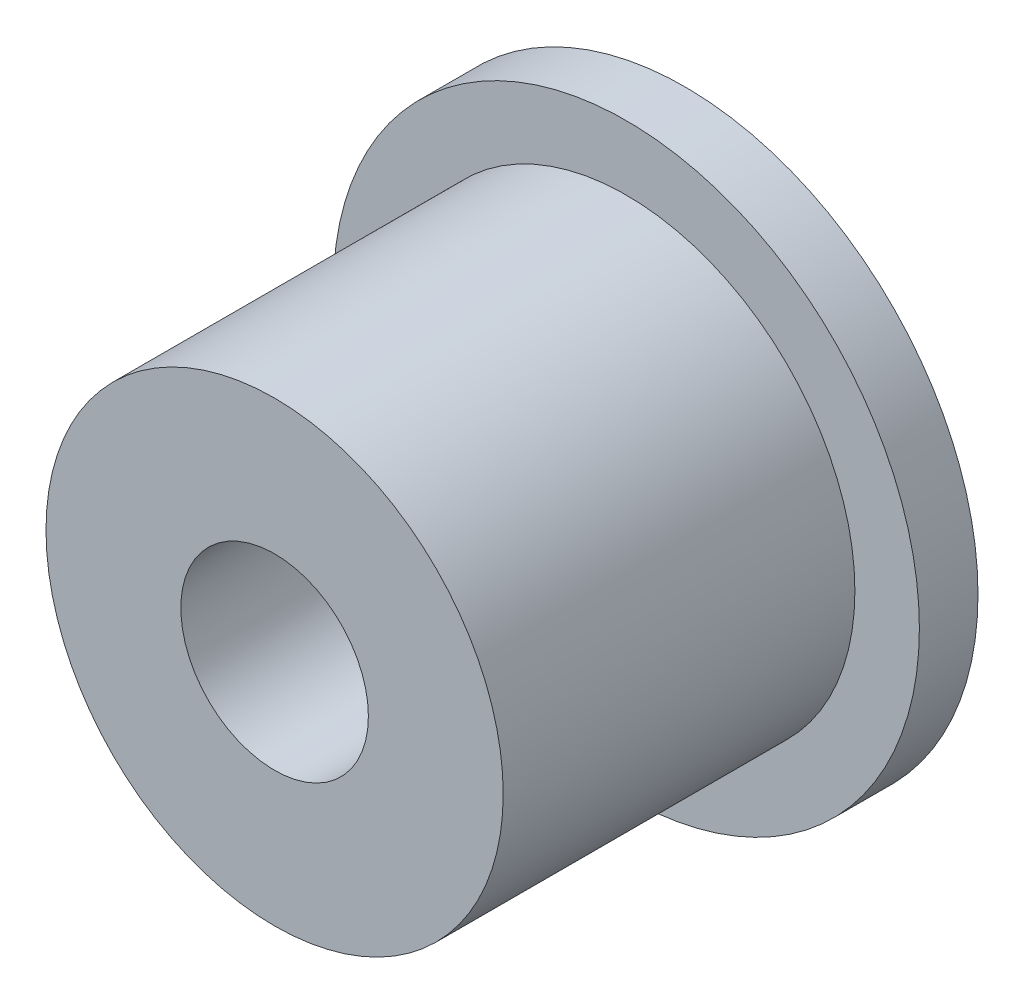
ISO-10303-21;
HEADER;
FILE_DESCRIPTION(('STEP AP214'),'2;1');
FILE_NAME('part.step','',(''),(''),'','','');
FILE_SCHEMA(('AUTOMOTIVE_DESIGN { 1 0 10303 214 1 1 1 1 }'));
ENDSEC;
DATA;
#1=APPLICATION_CONTEXT('core data for automotive mechanical design processes');
#2=APPLICATION_PROTOCOL_DEFINITION('international standard','automotive_design',2000,#1);
#3=PRODUCT_CONTEXT('',#1,'mechanical');
#4=PRODUCT('Part','Part','',(#3));
#5=PRODUCT_RELATED_PRODUCT_CATEGORY('part','',(#4));
#6=PRODUCT_DEFINITION_FORMATION('','',#4);
#7=PRODUCT_DEFINITION_CONTEXT('part definition',#1,'design');
#8=PRODUCT_DEFINITION('design','',#6,#7);
#9=PRODUCT_DEFINITION_SHAPE('','',#8);
#10=(LENGTH_UNIT() NAMED_UNIT(*) SI_UNIT(.MILLI.,.METRE.));
#11=(NAMED_UNIT(*) PLANE_ANGLE_UNIT() SI_UNIT($,.RADIAN.));
#12=(NAMED_UNIT(*) SI_UNIT($,.STERADIAN.) SOLID_ANGLE_UNIT());
#13=UNCERTAINTY_MEASURE_WITH_UNIT(LENGTH_MEASURE(1.E-05),#10,'distance_accuracy_value','');
#14=(GEOMETRIC_REPRESENTATION_CONTEXT(3) GLOBAL_UNCERTAINTY_ASSIGNED_CONTEXT((#13)) GLOBAL_UNIT_ASSIGNED_CONTEXT((#10,
#11,#12)) REPRESENTATION_CONTEXT('',''));
#15=CARTESIAN_POINT('',(0.,0.,0.));
#16=DIRECTION('',(0.,0.,1.));
#17=DIRECTION('',(1.,0.,0.));
#18=AXIS2_PLACEMENT_3D('',#15,#16,#17);
#19=CARTESIAN_POINT('',(0.,0.,1.));
#20=DIRECTION('',(0.,0.,1.));
#21=DIRECTION('',(1.,0.,0.));
#22=AXIS2_PLACEMENT_3D('',#19,#20,#21);
#23=PLANE('',#22);
#24=CARTESIAN_POINT('',(0.,0.,1.));
#25=DIRECTION('',(0.,0.,1.));
#26=DIRECTION('',(1.,0.,0.));
#27=AXIS2_PLACEMENT_3D('',#24,#25,#26);
#28=CIRCLE('',#27,3.9);
#29=CARTESIAN_POINT('',(3.9,0.,1.));
#30=VERTEX_POINT('',#29);
#31=EDGE_CURVE('E10',#30,#30,#28,.T.);
#32=ORIENTED_EDGE('',*,*,#31,.F.);
#33=EDGE_LOOP('',(#32));
#34=FACE_BOUND('',#33,.T.);
#35=CARTESIAN_POINT('',(0.,0.,1.));
#36=DIRECTION('',(0.,0.,-1.));
#37=DIRECTION('',(-1.,0.,0.));
#38=AXIS2_PLACEMENT_3D('',#35,#36,#37);
#39=CIRCLE('',#38,5.);
#40=CARTESIAN_POINT('',(-5.,0.,1.));
#41=VERTEX_POINT('',#40);
#42=EDGE_CURVE('E24',#41,#41,#39,.T.);
#43=ORIENTED_EDGE('',*,*,#42,.F.);
#44=EDGE_LOOP('',(#43));
#45=FACE_BOUND('',#44,.T.);
#46=ADVANCED_FACE('F15',(#34,#45),#23,.T.);
#47=CARTESIAN_POINT('',(0.,0.,0.));
#48=DIRECTION('',(0.,0.,-1.));
#49=DIRECTION('',(-1.,0.,0.));
#50=AXIS2_PLACEMENT_3D('',#47,#48,#49);
#51=PLANE('',#50);
#52=CARTESIAN_POINT('',(0.,0.,0.));
#53=DIRECTION('',(0.,0.,-1.));
#54=DIRECTION('',(-1.,0.,0.));
#55=AXIS2_PLACEMENT_3D('',#52,#53,#54);
#56=CIRCLE('',#55,1.6);
#57=CARTESIAN_POINT('',(-1.6,0.,0.));
#58=VERTEX_POINT('',#57);
#59=EDGE_CURVE('E41',#58,#58,#56,.T.);
#60=ORIENTED_EDGE('',*,*,#59,.F.);
#61=EDGE_LOOP('',(#60));
#62=FACE_BOUND('',#61,.T.);
#63=CARTESIAN_POINT('',(0.,0.,0.));
#64=DIRECTION('',(0.,0.,1.));
#65=DIRECTION('',(1.,0.,0.));
#66=AXIS2_PLACEMENT_3D('',#63,#64,#65);
#67=CIRCLE('',#66,5.);
#68=CARTESIAN_POINT('',(5.,0.,0.));
#69=VERTEX_POINT('',#68);
#70=EDGE_CURVE('E31',#69,#69,#67,.T.);
#71=ORIENTED_EDGE('',*,*,#70,.F.);
#72=EDGE_LOOP('',(#71));
#73=FACE_BOUND('',#72,.T.);
#74=ADVANCED_FACE('F66',(#62,#73),#51,.T.);
#75=CARTESIAN_POINT('',(0.,0.,0.));
#76=DIRECTION('',(0.,0.,1.));
#77=DIRECTION('',(1.,0.,0.));
#78=AXIS2_PLACEMENT_3D('',#75,#76,#77);
#79=CYLINDRICAL_SURFACE('',#78,5.);
#80=ORIENTED_EDGE('',*,*,#42,.T.);
#81=EDGE_LOOP('',(#80));
#82=FACE_BOUND('',#81,.T.);
#83=ORIENTED_EDGE('',*,*,#70,.T.);
#84=EDGE_LOOP('',(#83));
#85=FACE_BOUND('',#84,.T.);
#86=ADVANCED_FACE('F17',(#82,#85),#79,.T.);
#87=CARTESIAN_POINT('',(0.,0.,7.));
#88=DIRECTION('',(0.,0.,1.));
#89=DIRECTION('',(1.,0.,0.));
#90=AXIS2_PLACEMENT_3D('',#87,#88,#89);
#91=PLANE('',#90);
#92=CARTESIAN_POINT('',(0.,0.,7.));
#93=DIRECTION('',(0.,0.,1.));
#94=DIRECTION('',(1.,0.,0.));
#95=AXIS2_PLACEMENT_3D('',#92,#93,#94);
#96=CIRCLE('',#95,1.6);
#97=CARTESIAN_POINT('',(1.6,0.,7.));
#98=VERTEX_POINT('',#97);
#99=EDGE_CURVE('E19',#98,#98,#96,.T.);
#100=ORIENTED_EDGE('',*,*,#99,.F.);
#101=EDGE_LOOP('',(#100));
#102=FACE_BOUND('',#101,.T.);
#103=CARTESIAN_POINT('',(0.,0.,7.));
#104=DIRECTION('',(0.,0.,-1.));
#105=DIRECTION('',(-1.,0.,0.));
#106=AXIS2_PLACEMENT_3D('',#103,#104,#105);
#107=CIRCLE('',#106,3.9);
#108=CARTESIAN_POINT('',(-3.9,0.,7.));
#109=VERTEX_POINT('',#108);
#110=EDGE_CURVE('E37',#109,#109,#107,.T.);
#111=ORIENTED_EDGE('',*,*,#110,.F.);
#112=EDGE_LOOP('',(#111));
#113=FACE_BOUND('',#112,.T.);
#114=ADVANCED_FACE('F51',(#102,#113),#91,.T.);
#115=CARTESIAN_POINT('',(0.,0.,1.));
#116=DIRECTION('',(0.,0.,1.));
#117=DIRECTION('',(1.,0.,0.));
#118=AXIS2_PLACEMENT_3D('',#115,#116,#117);
#119=CYLINDRICAL_SURFACE('',#118,3.9);
#120=ORIENTED_EDGE('',*,*,#110,.T.);
#121=EDGE_LOOP('',(#120));
#122=FACE_BOUND('',#121,.T.);
#123=ORIENTED_EDGE('',*,*,#31,.T.);
#124=EDGE_LOOP('',(#123));
#125=FACE_BOUND('',#124,.T.);
#126=ADVANCED_FACE('F54',(#122,#125),#119,.T.);
#127=CARTESIAN_POINT('',(0.,0.,-1.));
#128=DIRECTION('',(0.,0.,1.));
#129=DIRECTION('',(1.,0.,0.));
#130=AXIS2_PLACEMENT_3D('',#127,#128,#129);
#131=CYLINDRICAL_SURFACE('',#130,1.6);
#132=ORIENTED_EDGE('',*,*,#59,.T.);
#133=EDGE_LOOP('',(#132));
#134=FACE_BOUND('',#133,.T.);
#135=ORIENTED_EDGE('',*,*,#99,.T.);
#136=EDGE_LOOP('',(#135));
#137=FACE_BOUND('',#136,.T.);
#138=ADVANCED_FACE('F49',(#134,#137),#131,.F.);
#139=CLOSED_SHELL('',(#46,#74,#86,#114,#126,#138));
#140=MANIFOLD_SOLID_BREP('B1',#139);
#141=ADVANCED_BREP_SHAPE_REPRESENTATION('',(#18,#140),#14);
#142=SHAPE_DEFINITION_REPRESENTATION(#9,#141);
ENDSEC;
END-ISO-10303-21;
